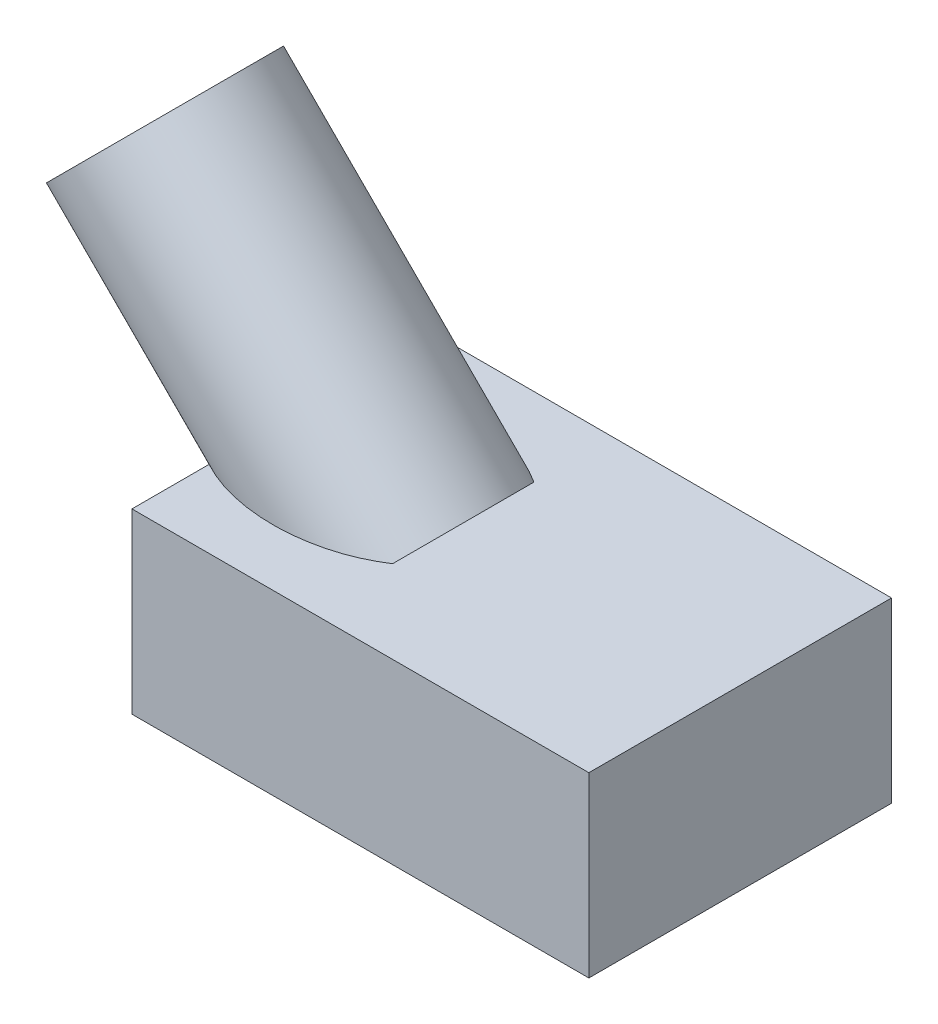
ISO-10303-21;
HEADER;
FILE_DESCRIPTION(('STEP AP214'),'2;1');
FILE_NAME('part.step','',(''),(''),'','','');
FILE_SCHEMA(('AUTOMOTIVE_DESIGN { 1 0 10303 214 1 1 1 1 }'));
ENDSEC;
DATA;
#1=APPLICATION_CONTEXT('core data for automotive mechanical design processes');
#2=APPLICATION_PROTOCOL_DEFINITION('international standard','automotive_design',2000,#1);
#3=PRODUCT_CONTEXT('',#1,'mechanical');
#4=PRODUCT('Part','Part','',(#3));
#5=PRODUCT_RELATED_PRODUCT_CATEGORY('part','',(#4));
#6=PRODUCT_DEFINITION_FORMATION('','',#4);
#7=PRODUCT_DEFINITION_CONTEXT('part definition',#1,'design');
#8=PRODUCT_DEFINITION('design','',#6,#7);
#9=PRODUCT_DEFINITION_SHAPE('','',#8);
#10=(LENGTH_UNIT() NAMED_UNIT(*) SI_UNIT(.MILLI.,.METRE.));
#11=(NAMED_UNIT(*) PLANE_ANGLE_UNIT() SI_UNIT($,.RADIAN.));
#12=(NAMED_UNIT(*) SI_UNIT($,.STERADIAN.) SOLID_ANGLE_UNIT());
#13=UNCERTAINTY_MEASURE_WITH_UNIT(LENGTH_MEASURE(1.E-05),#10,'distance_accuracy_value','');
#14=(GEOMETRIC_REPRESENTATION_CONTEXT(3) GLOBAL_UNCERTAINTY_ASSIGNED_CONTEXT((#13)) GLOBAL_UNIT_ASSIGNED_CONTEXT((#10,
#11,#12)) REPRESENTATION_CONTEXT('',''));
#15=CARTESIAN_POINT('',(0.,0.,0.));
#16=DIRECTION('',(0.,0.,1.));
#17=DIRECTION('',(1.,0.,0.));
#18=AXIS2_PLACEMENT_3D('',#15,#16,#17);
#19=CARTESIAN_POINT('',(0.,50.,0.));
#20=DIRECTION('',(0.,1.,0.));
#21=DIRECTION('',(0.,0.,1.));
#22=AXIS2_PLACEMENT_3D('',#19,#20,#21);
#23=PLANE('',#22);
#24=DIRECTION('',(0.,0.,1.));
#25=VECTOR('',#24,1.);
#26=CARTESIAN_POINT('',(-23.6609974287925,50.,0.));
#27=LINE('',#26,#25);
#28=CARTESIAN_POINT('',(-23.6609974287925,50.,-19.8585915391873));
#29=VERTEX_POINT('',#28);
#30=CARTESIAN_POINT('',(-23.6609974287925,50.,19.8585915391873));
#31=VERTEX_POINT('',#30);
#32=EDGE_CURVE('E93',#29,#31,#27,.T.);
#33=ORIENTED_EDGE('',*,*,#32,.T.);
#34=CARTESIAN_POINT('',(-50.0000000000002,50.,0.));
#35=DIRECTION('',(0.,1.,0.));
#36=DIRECTION('',(1.,0.,0.));
#37=AXIS2_PLACEMENT_3D('',#34,#35,#36);
#38=ELLIPSE('',#37,38.5028618713811,27.2256347243425);
#39=CARTESIAN_POINT('',(-73.6609974287923,50.,21.4782165572626));
#40=VERTEX_POINT('',#39);
#41=EDGE_CURVE('E11',#31,#40,#38,.F.);
#42=ORIENTED_EDGE('',*,*,#41,.T.);
#43=DIRECTION('',(0.,0.,1.));
#44=VECTOR('',#43,1.);
#45=CARTESIAN_POINT('',(-73.6609974287923,50.,-41.9458457580623));
#46=LINE('',#45,#44);
#47=CARTESIAN_POINT('',(-73.6609974287923,50.,43.1735290485421));
#48=VERTEX_POINT('',#47);
#49=EDGE_CURVE('E83',#40,#48,#46,.T.);
#50=ORIENTED_EDGE('',*,*,#49,.T.);
#51=DIRECTION('',(1.,0.,0.));
#52=VECTOR('',#51,1.);
#53=CARTESIAN_POINT('',(-73.6609974287923,50.,43.1735290485421));
#54=LINE('',#53,#52);
#55=CARTESIAN_POINT('',(54.8365203081009,50.,43.1735290485421));
#56=VERTEX_POINT('',#55);
#57=EDGE_CURVE('E106',#48,#56,#54,.T.);
#58=ORIENTED_EDGE('',*,*,#57,.T.);
#59=DIRECTION('',(0.,0.,-1.));
#60=VECTOR('',#59,1.);
#61=CARTESIAN_POINT('',(54.8365203081009,50.,-41.9458457580623));
#62=LINE('',#61,#60);
#63=CARTESIAN_POINT('',(54.8365203081009,50.,-41.9458457580623));
#64=VERTEX_POINT('',#63);
#65=EDGE_CURVE('E108',#56,#64,#62,.T.);
#66=ORIENTED_EDGE('',*,*,#65,.T.);
#67=DIRECTION('',(-1.,0.,0.));
#68=VECTOR('',#67,1.);
#69=CARTESIAN_POINT('',(-73.6609974287923,50.,-41.9458457580623));
#70=LINE('',#69,#68);
#71=CARTESIAN_POINT('',(-73.6609974287923,50.,-41.9458457580623));
#72=VERTEX_POINT('',#71);
#73=EDGE_CURVE('E56',#64,#72,#70,.T.);
#74=ORIENTED_EDGE('',*,*,#73,.T.);
#75=CARTESIAN_POINT('',(-73.6609974287923,50.,-21.4782165572626));
#76=VERTEX_POINT('',#75);
#77=EDGE_CURVE('E104',#72,#76,#46,.T.);
#78=ORIENTED_EDGE('',*,*,#77,.T.);
#79=EDGE_CURVE('E37',#76,#29,#38,.F.);
#80=ORIENTED_EDGE('',*,*,#79,.T.);
#81=EDGE_LOOP('',(#33,#42,#50,#58,#66,#74,#78,#80));
#82=FACE_BOUND('',#81,.T.);
#83=ADVANCED_FACE('F33',(#82),#23,.T.);
#84=CARTESIAN_POINT('',(-73.6609974287923,50.,-41.9458457580623));
#85=DIRECTION('',(1.,0.,0.));
#86=DIRECTION('',(0.,0.,-1.));
#87=AXIS2_PLACEMENT_3D('',#84,#85,#86);
#88=PLANE('',#87);
#89=CARTESIAN_POINT('',(-73.6609974287923,73.660997428792,0.));
#90=DIRECTION('',(1.,0.,0.));
#91=DIRECTION('',(0.,-1.,0.));
#92=AXIS2_PLACEMENT_3D('',#89,#90,#91);
#93=ELLIPSE('',#92,38.5028618713809,27.2256347243425);
#94=EDGE_CURVE('E111',#76,#40,#93,.F.);
#95=ORIENTED_EDGE('',*,*,#94,.F.);
#96=ORIENTED_EDGE('',*,*,#77,.F.);
#97=DIRECTION('',(0.,-1.,0.));
#98=VECTOR('',#97,1.);
#99=CARTESIAN_POINT('',(-73.6609974287923,50.,-41.9458457580623));
#100=LINE('',#99,#98);
#101=CARTESIAN_POINT('',(-73.6609974287923,0.,-41.9458457580623));
#102=VERTEX_POINT('',#101);
#103=EDGE_CURVE('E115',#72,#102,#100,.T.);
#104=ORIENTED_EDGE('',*,*,#103,.T.);
#105=DIRECTION('',(0.,0.,1.));
#106=VECTOR('',#105,1.);
#107=CARTESIAN_POINT('',(-73.6609974287923,0.,-41.9458457580623));
#108=LINE('',#107,#106);
#109=CARTESIAN_POINT('',(-73.6609974287923,0.,43.1735290485421));
#110=VERTEX_POINT('',#109);
#111=EDGE_CURVE('E116',#102,#110,#108,.T.);
#112=ORIENTED_EDGE('',*,*,#111,.T.);
#113=DIRECTION('',(0.,-1.,0.));
#114=VECTOR('',#113,1.);
#115=CARTESIAN_POINT('',(-73.6609974287923,50.,43.1735290485421));
#116=LINE('',#115,#114);
#117=EDGE_CURVE('E96',#48,#110,#116,.T.);
#118=ORIENTED_EDGE('',*,*,#117,.F.);
#119=ORIENTED_EDGE('',*,*,#49,.F.);
#120=EDGE_LOOP('',(#95,#96,#104,#112,#118,#119));
#121=FACE_BOUND('',#120,.T.);
#122=ADVANCED_FACE('F35',(#121),#88,.F.);
#123=CARTESIAN_POINT('',(-73.6609974287923,50.,43.1735290485421));
#124=DIRECTION('',(0.,0.,-1.));
#125=DIRECTION('',(-1.,0.,0.));
#126=AXIS2_PLACEMENT_3D('',#123,#124,#125);
#127=PLANE('',#126);
#128=DIRECTION('',(1.,0.,0.));
#129=VECTOR('',#128,1.);
#130=CARTESIAN_POINT('',(-73.6609974287923,0.,43.1735290485421));
#131=LINE('',#130,#129);
#132=CARTESIAN_POINT('',(54.8365203081009,0.,43.1735290485421));
#133=VERTEX_POINT('',#132);
#134=EDGE_CURVE('E119',#110,#133,#131,.T.);
#135=ORIENTED_EDGE('',*,*,#134,.T.);
#136=DIRECTION('',(0.,-1.,0.));
#137=VECTOR('',#136,1.);
#138=CARTESIAN_POINT('',(54.8365203081009,50.,43.1735290485421));
#139=LINE('',#138,#137);
#140=EDGE_CURVE('E127',#56,#133,#139,.T.);
#141=ORIENTED_EDGE('',*,*,#140,.F.);
#142=ORIENTED_EDGE('',*,*,#57,.F.);
#143=ORIENTED_EDGE('',*,*,#117,.T.);
#144=EDGE_LOOP('',(#135,#141,#142,#143));
#145=FACE_BOUND('',#144,.T.);
#146=ADVANCED_FACE('F133',(#145),#127,.F.);
#147=CARTESIAN_POINT('',(54.8365203081009,50.,-41.9458457580623));
#148=DIRECTION('',(-1.,0.,0.));
#149=DIRECTION('',(0.,0.,1.));
#150=AXIS2_PLACEMENT_3D('',#147,#148,#149);
#151=PLANE('',#150);
#152=DIRECTION('',(0.,0.,-1.));
#153=VECTOR('',#152,1.);
#154=CARTESIAN_POINT('',(54.8365203081009,0.,-41.9458457580623));
#155=LINE('',#154,#153);
#156=CARTESIAN_POINT('',(54.8365203081009,0.,-41.9458457580623));
#157=VERTEX_POINT('',#156);
#158=EDGE_CURVE('E121',#133,#157,#155,.T.);
#159=ORIENTED_EDGE('',*,*,#158,.T.);
#160=DIRECTION('',(0.,-1.,0.));
#161=VECTOR('',#160,1.);
#162=CARTESIAN_POINT('',(54.8365203081009,50.,-41.9458457580623));
#163=LINE('',#162,#161);
#164=EDGE_CURVE('E125',#64,#157,#163,.T.);
#165=ORIENTED_EDGE('',*,*,#164,.F.);
#166=ORIENTED_EDGE('',*,*,#65,.F.);
#167=ORIENTED_EDGE('',*,*,#140,.T.);
#168=EDGE_LOOP('',(#159,#165,#166,#167));
#169=FACE_BOUND('',#168,.T.);
#170=ADVANCED_FACE('F141',(#169),#151,.F.);
#171=CARTESIAN_POINT('',(-73.6609974287923,50.,-41.9458457580623));
#172=DIRECTION('',(0.,0.,1.));
#173=DIRECTION('',(1.,0.,0.));
#174=AXIS2_PLACEMENT_3D('',#171,#172,#173);
#175=PLANE('',#174);
#176=DIRECTION('',(-1.,0.,0.));
#177=VECTOR('',#176,1.);
#178=CARTESIAN_POINT('',(-73.6609974287923,0.,-41.9458457580623));
#179=LINE('',#178,#177);
#180=EDGE_CURVE('E77',#157,#102,#179,.T.);
#181=ORIENTED_EDGE('',*,*,#180,.T.);
#182=ORIENTED_EDGE('',*,*,#103,.F.);
#183=ORIENTED_EDGE('',*,*,#73,.F.);
#184=ORIENTED_EDGE('',*,*,#164,.T.);
#185=EDGE_LOOP('',(#181,#182,#183,#184));
#186=FACE_BOUND('',#185,.T.);
#187=ADVANCED_FACE('F143',(#186),#175,.F.);
#188=CARTESIAN_POINT('',(0.,0.,0.));
#189=DIRECTION('',(0.,1.,0.));
#190=DIRECTION('',(0.,0.,1.));
#191=AXIS2_PLACEMENT_3D('',#188,#189,#190);
#192=PLANE('',#191);
#193=ORIENTED_EDGE('',*,*,#111,.F.);
#194=ORIENTED_EDGE('',*,*,#180,.F.);
#195=ORIENTED_EDGE('',*,*,#158,.F.);
#196=ORIENTED_EDGE('',*,*,#134,.F.);
#197=EDGE_LOOP('',(#193,#194,#195,#196));
#198=FACE_BOUND('',#197,.T.);
#199=ADVANCED_FACE('F137',(#198),#192,.F.);
#200=CARTESIAN_POINT('',(-107.541176833051,107.541176833051,0.));
#201=DIRECTION('',(0.707106781186549,-0.707106781186546,0.));
#202=DIRECTION('',(0.707106781186546,0.707106781186549,0.));
#203=AXIS2_PLACEMENT_3D('',#200,#201,#202);
#204=CYLINDRICAL_SURFACE('',#203,27.2256347243425);
#205=ORIENTED_EDGE('',*,*,#41,.F.);
#206=CARTESIAN_POINT('',(-36.8304987143963,36.8304987143962,0.));
#207=DIRECTION('',(-0.707106781186549,0.707106781186546,0.));
#208=DIRECTION('',(-0.707106781186546,-0.707106781186549,0.));
#209=AXIS2_PLACEMENT_3D('',#206,#207,#208);
#210=CIRCLE('',#209,27.2256347243425);
#211=EDGE_CURVE('E47',#31,#29,#210,.T.);
#212=ORIENTED_EDGE('',*,*,#211,.T.);
#213=ORIENTED_EDGE('',*,*,#79,.F.);
#214=ORIENTED_EDGE('',*,*,#94,.T.);
#215=EDGE_LOOP('',(#205,#212,#213,#214));
#216=FACE_BOUND('',#215,.T.);
#217=CARTESIAN_POINT('',(-107.541176833051,107.541176833051,0.));
#218=DIRECTION('',(-0.707106781186549,0.707106781186546,0.));
#219=DIRECTION('',(-0.707106781186546,-0.707106781186549,0.));
#220=AXIS2_PLACEMENT_3D('',#217,#218,#219);
#221=CIRCLE('',#220,27.2256347243425);
#222=CARTESIAN_POINT('',(-126.792607768742,88.2897458973602,0.));
#223=VERTEX_POINT('',#222);
#224=EDGE_CURVE('E101',#223,#223,#221,.T.);
#225=ORIENTED_EDGE('',*,*,#224,.F.);
#226=EDGE_LOOP('',(#225));
#227=FACE_BOUND('',#226,.T.);
#228=ADVANCED_FACE('F98',(#216,#227),#204,.T.);
#229=CARTESIAN_POINT('',(-107.541176833051,107.541176833051,0.));
#230=DIRECTION('',(-0.707106781186549,0.707106781186546,0.));
#231=DIRECTION('',(-0.707106781186546,-0.707106781186549,0.));
#232=AXIS2_PLACEMENT_3D('',#229,#230,#231);
#233=PLANE('',#232);
#234=ORIENTED_EDGE('',*,*,#224,.T.);
#235=EDGE_LOOP('',(#234));
#236=FACE_BOUND('',#235,.T.);
#237=ADVANCED_FACE('F160',(#236),#233,.T.);
#238=CARTESIAN_POINT('',(-36.8304987143963,36.8304987143962,0.));
#239=DIRECTION('',(-0.707106781186549,0.707106781186546,0.));
#240=DIRECTION('',(-0.707106781186546,-0.707106781186549,0.));
#241=AXIS2_PLACEMENT_3D('',#238,#239,#240);
#242=PLANE('',#241);
#243=ORIENTED_EDGE('',*,*,#32,.F.);
#244=ORIENTED_EDGE('',*,*,#211,.F.);
#245=EDGE_LOOP('',(#243,#244));
#246=FACE_BOUND('',#245,.T.);
#247=ADVANCED_FACE('F94',(#246),#242,.F.);
#248=CLOSED_SHELL('',(#83,#122,#146,#170,#187,#199,#228,#237,#247));
#249=MANIFOLD_SOLID_BREP('B2',#248);
#250=ADVANCED_BREP_SHAPE_REPRESENTATION('',(#18,#249),#14);
#251=SHAPE_DEFINITION_REPRESENTATION(#9,#250);
ENDSEC;
END-ISO-10303-21;
